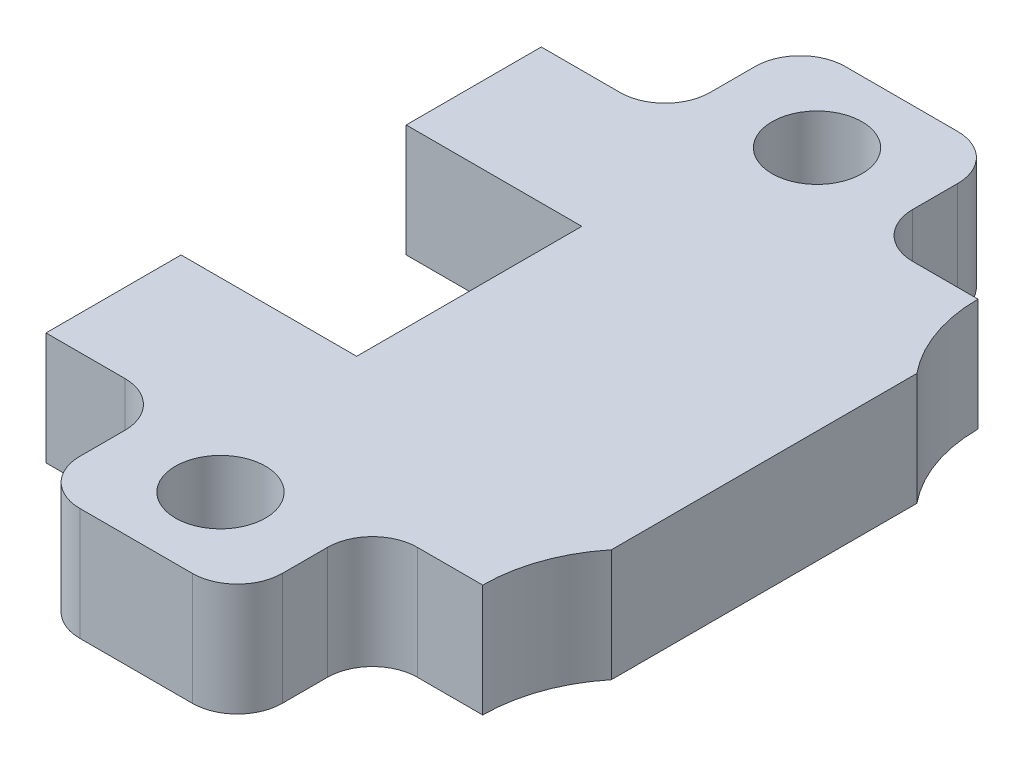
ISO-10303-21;
HEADER;
FILE_DESCRIPTION(('STEP AP214'),'2;1');
FILE_NAME('part.step','',(''),(''),'','','');
FILE_SCHEMA(('AUTOMOTIVE_DESIGN { 1 0 10303 214 1 1 1 1 }'));
ENDSEC;
DATA;
#1=APPLICATION_CONTEXT('core data for automotive mechanical design processes');
#2=APPLICATION_PROTOCOL_DEFINITION('international standard','automotive_design',2000,#1);
#3=PRODUCT_CONTEXT('',#1,'mechanical');
#4=PRODUCT('Part','Part','',(#3));
#5=PRODUCT_RELATED_PRODUCT_CATEGORY('part','',(#4));
#6=PRODUCT_DEFINITION_FORMATION('','',#4);
#7=PRODUCT_DEFINITION_CONTEXT('part definition',#1,'design');
#8=PRODUCT_DEFINITION('design','',#6,#7);
#9=PRODUCT_DEFINITION_SHAPE('','',#8);
#10=(LENGTH_UNIT() NAMED_UNIT(*) SI_UNIT(.MILLI.,.METRE.));
#11=(NAMED_UNIT(*) PLANE_ANGLE_UNIT() SI_UNIT($,.RADIAN.));
#12=(NAMED_UNIT(*) SI_UNIT($,.STERADIAN.) SOLID_ANGLE_UNIT());
#13=UNCERTAINTY_MEASURE_WITH_UNIT(LENGTH_MEASURE(1.E-05),#10,'distance_accuracy_value','');
#14=(GEOMETRIC_REPRESENTATION_CONTEXT(3) GLOBAL_UNCERTAINTY_ASSIGNED_CONTEXT((#13)) GLOBAL_UNIT_ASSIGNED_CONTEXT((#10,
#11,#12)) REPRESENTATION_CONTEXT('',''));
#15=CARTESIAN_POINT('',(0.,0.,0.));
#16=DIRECTION('',(0.,0.,1.));
#17=DIRECTION('',(1.,0.,0.));
#18=AXIS2_PLACEMENT_3D('',#15,#16,#17);
#19=CARTESIAN_POINT('',(12.5,101.4,-27.7));
#20=DIRECTION('',(0.,1.,0.));
#21=DIRECTION('',(0.,0.,1.));
#22=AXIS2_PLACEMENT_3D('',#19,#20,#21);
#23=PLANE('',#22);
#24=CARTESIAN_POINT('',(10.,101.4,0.549999999999988));
#25=DIRECTION('',(0.,1.,0.));
#26=DIRECTION('',(0.,0.,1.));
#27=AXIS2_PLACEMENT_3D('',#24,#25,#26);
#28=CIRCLE('',#27,2.);
#29=CARTESIAN_POINT('',(10.,101.4,2.54999999999999));
#30=VERTEX_POINT('',#29);
#31=EDGE_CURVE('E335',#30,#30,#28,.T.);
#32=ORIENTED_EDGE('',*,*,#31,.F.);
#33=EDGE_LOOP('',(#32));
#34=FACE_BOUND('',#33,.T.);
#35=CARTESIAN_POINT('',(12.5,101.4,-27.7));
#36=DIRECTION('',(0.,1.,0.));
#37=DIRECTION('',(0.,0.,1.));
#38=AXIS2_PLACEMENT_3D('',#35,#36,#37);
#39=CIRCLE('',#38,2.);
#40=CARTESIAN_POINT('',(14.5,101.4,-27.7));
#41=VERTEX_POINT('',#40);
#42=CARTESIAN_POINT('',(12.5,101.4,-29.7));
#43=VERTEX_POINT('',#42);
#44=EDGE_CURVE('E382',#41,#43,#39,.T.);
#45=ORIENTED_EDGE('',*,*,#44,.T.);
#46=DIRECTION('',(-1.,0.,0.));
#47=VECTOR('',#46,1.);
#48=CARTESIAN_POINT('',(12.5,101.4,-29.7));
#49=LINE('',#48,#47);
#50=CARTESIAN_POINT('',(7.5,101.4,-29.7));
#51=VERTEX_POINT('',#50);
#52=EDGE_CURVE('E240',#43,#51,#49,.T.);
#53=ORIENTED_EDGE('',*,*,#52,.T.);
#54=CARTESIAN_POINT('',(7.5,101.4,-27.7));
#55=DIRECTION('',(0.,1.,0.));
#56=DIRECTION('',(0.,0.,1.));
#57=AXIS2_PLACEMENT_3D('',#54,#55,#56);
#58=CIRCLE('',#57,2.);
#59=CARTESIAN_POINT('',(5.5,101.4,-27.7));
#60=VERTEX_POINT('',#59);
#61=EDGE_CURVE('E451',#51,#60,#58,.T.);
#62=ORIENTED_EDGE('',*,*,#61,.T.);
#63=DIRECTION('',(0.,0.,1.));
#64=VECTOR('',#63,1.);
#65=CARTESIAN_POINT('',(5.5,101.4,-27.7));
#66=LINE('',#65,#64);
#67=CARTESIAN_POINT('',(5.5,101.4,-25.7));
#68=VERTEX_POINT('',#67);
#69=EDGE_CURVE('E470',#60,#68,#66,.T.);
#70=ORIENTED_EDGE('',*,*,#69,.T.);
#71=CARTESIAN_POINT('',(3.5,101.4,-25.7));
#72=DIRECTION('',(0.,-1.,0.));
#73=DIRECTION('',(0.,0.,1.));
#74=AXIS2_PLACEMENT_3D('',#71,#72,#73);
#75=CIRCLE('',#74,2.);
#76=CARTESIAN_POINT('',(3.5,101.4,-23.7));
#77=VERTEX_POINT('',#76);
#78=EDGE_CURVE('E467',#68,#77,#75,.T.);
#79=ORIENTED_EDGE('',*,*,#78,.T.);
#80=DIRECTION('',(-1.,0.,0.));
#81=VECTOR('',#80,1.);
#82=CARTESIAN_POINT('',(3.5,101.4,-23.7));
#83=LINE('',#82,#81);
#84=CARTESIAN_POINT('',(0.,101.4,-23.7));
#85=VERTEX_POINT('',#84);
#86=EDGE_CURVE('E469',#77,#85,#83,.T.);
#87=ORIENTED_EDGE('',*,*,#86,.T.);
#88=DIRECTION('',(0.,0.,1.));
#89=VECTOR('',#88,1.);
#90=CARTESIAN_POINT('',(0.,101.4,-17.7));
#91=LINE('',#90,#89);
#92=CARTESIAN_POINT('',(0.,101.4,-17.7));
#93=VERTEX_POINT('',#92);
#94=EDGE_CURVE('E472',#85,#93,#91,.T.);
#95=ORIENTED_EDGE('',*,*,#94,.T.);
#96=DIRECTION('',(1.,0.,0.));
#97=VECTOR('',#96,1.);
#98=CARTESIAN_POINT('',(7.8,101.4,-17.7));
#99=LINE('',#98,#97);
#100=CARTESIAN_POINT('',(7.8,101.4,-17.7));
#101=VERTEX_POINT('',#100);
#102=EDGE_CURVE('E478',#93,#101,#99,.T.);
#103=ORIENTED_EDGE('',*,*,#102,.T.);
#104=DIRECTION('',(0.,0.,1.));
#105=VECTOR('',#104,1.);
#106=CARTESIAN_POINT('',(7.8,101.4,-7.7));
#107=LINE('',#106,#105);
#108=CARTESIAN_POINT('',(7.8,101.4,-7.7));
#109=VERTEX_POINT('',#108);
#110=EDGE_CURVE('E480',#101,#109,#107,.T.);
#111=ORIENTED_EDGE('',*,*,#110,.T.);
#112=DIRECTION('',(-1.,0.,0.));
#113=VECTOR('',#112,1.);
#114=CARTESIAN_POINT('',(0.,101.4,-7.7));
#115=LINE('',#114,#113);
#116=CARTESIAN_POINT('',(0.,101.4,-7.7));
#117=VERTEX_POINT('',#116);
#118=EDGE_CURVE('E482',#109,#117,#115,.T.);
#119=ORIENTED_EDGE('',*,*,#118,.T.);
#120=DIRECTION('',(0.,0.,1.));
#121=VECTOR('',#120,1.);
#122=CARTESIAN_POINT('',(0.,101.4,-1.7));
#123=LINE('',#122,#121);
#124=CARTESIAN_POINT('',(0.,101.4,-1.7));
#125=VERTEX_POINT('',#124);
#126=EDGE_CURVE('E484',#117,#125,#123,.T.);
#127=ORIENTED_EDGE('',*,*,#126,.T.);
#128=DIRECTION('',(1.,0.,0.));
#129=VECTOR('',#128,1.);
#130=CARTESIAN_POINT('',(0.,101.4,-1.7));
#131=LINE('',#130,#129);
#132=CARTESIAN_POINT('',(3.5,101.4,-1.7));
#133=VERTEX_POINT('',#132);
#134=EDGE_CURVE('E486',#125,#133,#131,.T.);
#135=ORIENTED_EDGE('',*,*,#134,.T.);
#136=CARTESIAN_POINT('',(3.5,101.4,0.3));
#137=DIRECTION('',(0.,-1.,0.));
#138=DIRECTION('',(0.,0.,1.));
#139=AXIS2_PLACEMENT_3D('',#136,#137,#138);
#140=CIRCLE('',#139,2.);
#141=CARTESIAN_POINT('',(5.5,101.4,0.3));
#142=VERTEX_POINT('',#141);
#143=EDGE_CURVE('E488',#133,#142,#140,.T.);
#144=ORIENTED_EDGE('',*,*,#143,.T.);
#145=DIRECTION('',(0.,0.,1.));
#146=VECTOR('',#145,1.);
#147=CARTESIAN_POINT('',(5.5,101.4,0.299999999999999));
#148=LINE('',#147,#146);
#149=CARTESIAN_POINT('',(5.5,101.4,2.3));
#150=VERTEX_POINT('',#149);
#151=EDGE_CURVE('E490',#142,#150,#148,.T.);
#152=ORIENTED_EDGE('',*,*,#151,.T.);
#153=CARTESIAN_POINT('',(7.5,101.4,2.3));
#154=DIRECTION('',(0.,1.,0.));
#155=DIRECTION('',(0.,0.,1.));
#156=AXIS2_PLACEMENT_3D('',#153,#154,#155);
#157=CIRCLE('',#156,2.);
#158=CARTESIAN_POINT('',(7.5,101.4,4.3));
#159=VERTEX_POINT('',#158);
#160=EDGE_CURVE('E492',#150,#159,#157,.T.);
#161=ORIENTED_EDGE('',*,*,#160,.T.);
#162=DIRECTION('',(1.,0.,0.));
#163=VECTOR('',#162,1.);
#164=CARTESIAN_POINT('',(7.5,101.4,4.3));
#165=LINE('',#164,#163);
#166=CARTESIAN_POINT('',(12.5,101.4,4.3));
#167=VERTEX_POINT('',#166);
#168=EDGE_CURVE('E494',#159,#167,#165,.T.);
#169=ORIENTED_EDGE('',*,*,#168,.T.);
#170=CARTESIAN_POINT('',(12.5,101.4,2.3));
#171=DIRECTION('',(0.,1.,0.));
#172=DIRECTION('',(0.,0.,1.));
#173=AXIS2_PLACEMENT_3D('',#170,#171,#172);
#174=CIRCLE('',#173,2.);
#175=CARTESIAN_POINT('',(14.5,101.4,2.3));
#176=VERTEX_POINT('',#175);
#177=EDGE_CURVE('E496',#167,#176,#174,.T.);
#178=ORIENTED_EDGE('',*,*,#177,.T.);
#179=DIRECTION('',(0.,0.,-1.));
#180=VECTOR('',#179,1.);
#181=CARTESIAN_POINT('',(14.5,101.4,2.3));
#182=LINE('',#181,#180);
#183=CARTESIAN_POINT('',(14.5,101.4,0.3));
#184=VERTEX_POINT('',#183);
#185=EDGE_CURVE('E498',#176,#184,#182,.T.);
#186=ORIENTED_EDGE('',*,*,#185,.T.);
#187=CARTESIAN_POINT('',(16.5,101.4,0.3));
#188=DIRECTION('',(0.,-1.,0.));
#189=DIRECTION('',(0.,0.,1.));
#190=AXIS2_PLACEMENT_3D('',#187,#188,#189);
#191=CIRCLE('',#190,2.);
#192=CARTESIAN_POINT('',(16.5,101.4,-1.7));
#193=VERTEX_POINT('',#192);
#194=EDGE_CURVE('E500',#184,#193,#191,.T.);
#195=ORIENTED_EDGE('',*,*,#194,.T.);
#196=DIRECTION('',(1.,0.,0.));
#197=VECTOR('',#196,1.);
#198=CARTESIAN_POINT('',(16.5,101.4,-1.7));
#199=LINE('',#198,#197);
#200=CARTESIAN_POINT('',(19.4,101.4,-1.7));
#201=VERTEX_POINT('',#200);
#202=EDGE_CURVE('E502',#193,#201,#199,.T.);
#203=ORIENTED_EDGE('',*,*,#202,.T.);
#204=CARTESIAN_POINT('',(26.075,101.4,-1.7));
#205=DIRECTION('',(0.,-1.,0.));
#206=DIRECTION('',(0.,0.,1.));
#207=AXIS2_PLACEMENT_3D('',#204,#205,#206);
#208=CIRCLE('',#207,6.67500000000001);
#209=CARTESIAN_POINT('',(20.9,101.4,-5.91604079676656));
#210=VERTEX_POINT('',#209);
#211=EDGE_CURVE('E504',#201,#210,#208,.T.);
#212=ORIENTED_EDGE('',*,*,#211,.T.);
#213=DIRECTION('',(0.,0.,-1.));
#214=VECTOR('',#213,1.);
#215=CARTESIAN_POINT('',(20.9,101.4,-5.91604079676656));
#216=LINE('',#215,#214);
#217=CARTESIAN_POINT('',(20.9,101.4,-19.4839592032334));
#218=VERTEX_POINT('',#217);
#219=EDGE_CURVE('E506',#210,#218,#216,.T.);
#220=ORIENTED_EDGE('',*,*,#219,.T.);
#221=CARTESIAN_POINT('',(26.075,101.4,-23.7));
#222=DIRECTION('',(0.,-1.,0.));
#223=DIRECTION('',(0.,0.,1.));
#224=AXIS2_PLACEMENT_3D('',#221,#222,#223);
#225=CIRCLE('',#224,6.67500000000001);
#226=CARTESIAN_POINT('',(19.4,101.4,-23.7));
#227=VERTEX_POINT('',#226);
#228=EDGE_CURVE('E313',#218,#227,#225,.T.);
#229=ORIENTED_EDGE('',*,*,#228,.T.);
#230=DIRECTION('',(-1.,0.,0.));
#231=VECTOR('',#230,1.);
#232=CARTESIAN_POINT('',(19.4,101.4,-23.7));
#233=LINE('',#232,#231);
#234=CARTESIAN_POINT('',(16.5,101.4,-23.7));
#235=VERTEX_POINT('',#234);
#236=EDGE_CURVE('E307',#227,#235,#233,.T.);
#237=ORIENTED_EDGE('',*,*,#236,.T.);
#238=CARTESIAN_POINT('',(16.5,101.4,-25.7));
#239=DIRECTION('',(0.,-1.,0.));
#240=DIRECTION('',(0.,0.,1.));
#241=AXIS2_PLACEMENT_3D('',#238,#239,#240);
#242=CIRCLE('',#241,1.99999999999999);
#243=CARTESIAN_POINT('',(14.5,101.4,-25.7));
#244=VERTEX_POINT('',#243);
#245=EDGE_CURVE('E311',#235,#244,#242,.T.);
#246=ORIENTED_EDGE('',*,*,#245,.T.);
#247=DIRECTION('',(0.,0.,-1.));
#248=VECTOR('',#247,1.);
#249=CARTESIAN_POINT('',(14.5,101.4,-25.7));
#250=LINE('',#249,#248);
#251=EDGE_CURVE('E143',#244,#41,#250,.T.);
#252=ORIENTED_EDGE('',*,*,#251,.T.);
#253=EDGE_LOOP('',(#45,#53,#62,#70,#79,#87,#95,#103,#111,#119,#127,#135,#144,#152,#161,#169,
#178,#186,#195,#203,#212,#220,#229,#237,#246,#252));
#254=FACE_BOUND('',#253,.T.);
#255=CARTESIAN_POINT('',(10.,101.4,-25.95));
#256=DIRECTION('',(0.,1.,0.));
#257=DIRECTION('',(0.,0.,1.));
#258=AXIS2_PLACEMENT_3D('',#255,#256,#257);
#259=CIRCLE('',#258,2.);
#260=CARTESIAN_POINT('',(10.,101.4,-23.95));
#261=VERTEX_POINT('',#260);
#262=EDGE_CURVE('E548',#261,#261,#259,.T.);
#263=ORIENTED_EDGE('',*,*,#262,.F.);
#264=EDGE_LOOP('',(#263));
#265=FACE_BOUND('',#264,.T.);
#266=ADVANCED_FACE('F126',(#34,#254,#265),#23,.T.);
#267=CARTESIAN_POINT('',(12.5,96.4,-27.7));
#268=DIRECTION('',(0.,1.,0.));
#269=DIRECTION('',(0.,0.,1.));
#270=AXIS2_PLACEMENT_3D('',#267,#268,#269);
#271=PLANE('',#270);
#272=CARTESIAN_POINT('',(12.5,96.4,-27.7));
#273=DIRECTION('',(0.,1.,0.));
#274=DIRECTION('',(0.,0.,1.));
#275=AXIS2_PLACEMENT_3D('',#272,#273,#274);
#276=CIRCLE('',#275,2.);
#277=CARTESIAN_POINT('',(14.5,96.4,-27.7));
#278=VERTEX_POINT('',#277);
#279=CARTESIAN_POINT('',(12.5,96.4,-29.7));
#280=VERTEX_POINT('',#279);
#281=EDGE_CURVE('E331',#278,#280,#276,.T.);
#282=ORIENTED_EDGE('',*,*,#281,.F.);
#283=DIRECTION('',(0.,0.,-1.));
#284=VECTOR('',#283,1.);
#285=CARTESIAN_POINT('',(14.5,96.4,-25.7));
#286=LINE('',#285,#284);
#287=CARTESIAN_POINT('',(14.5,96.4,-25.7));
#288=VERTEX_POINT('',#287);
#289=EDGE_CURVE('E232',#288,#278,#286,.T.);
#290=ORIENTED_EDGE('',*,*,#289,.F.);
#291=CARTESIAN_POINT('',(16.5,96.4,-25.7));
#292=DIRECTION('',(0.,-1.,0.));
#293=DIRECTION('',(0.,0.,1.));
#294=AXIS2_PLACEMENT_3D('',#291,#292,#293);
#295=CIRCLE('',#294,1.99999999999999);
#296=CARTESIAN_POINT('',(16.5,96.4,-23.7));
#297=VERTEX_POINT('',#296);
#298=EDGE_CURVE('E226',#297,#288,#295,.T.);
#299=ORIENTED_EDGE('',*,*,#298,.F.);
#300=DIRECTION('',(-1.,0.,0.));
#301=VECTOR('',#300,1.);
#302=CARTESIAN_POINT('',(19.4,96.4,-23.7));
#303=LINE('',#302,#301);
#304=CARTESIAN_POINT('',(19.4,96.4,-23.7));
#305=VERTEX_POINT('',#304);
#306=EDGE_CURVE('E321',#305,#297,#303,.T.);
#307=ORIENTED_EDGE('',*,*,#306,.F.);
#308=CARTESIAN_POINT('',(26.075,96.4,-23.7));
#309=DIRECTION('',(0.,-1.,0.));
#310=DIRECTION('',(0.,0.,1.));
#311=AXIS2_PLACEMENT_3D('',#308,#309,#310);
#312=CIRCLE('',#311,6.67500000000001);
#313=CARTESIAN_POINT('',(20.9,96.4,-19.4839592032334));
#314=VERTEX_POINT('',#313);
#315=EDGE_CURVE('E377',#314,#305,#312,.T.);
#316=ORIENTED_EDGE('',*,*,#315,.F.);
#317=DIRECTION('',(0.,0.,-1.));
#318=VECTOR('',#317,1.);
#319=CARTESIAN_POINT('',(20.9,96.4,-5.91604079676656));
#320=LINE('',#319,#318);
#321=CARTESIAN_POINT('',(20.9,96.4,-5.91604079676656));
#322=VERTEX_POINT('',#321);
#323=EDGE_CURVE('E375',#322,#314,#320,.T.);
#324=ORIENTED_EDGE('',*,*,#323,.F.);
#325=CARTESIAN_POINT('',(26.075,96.4,-1.7));
#326=DIRECTION('',(0.,-1.,0.));
#327=DIRECTION('',(0.,0.,1.));
#328=AXIS2_PLACEMENT_3D('',#325,#326,#327);
#329=CIRCLE('',#328,6.67500000000001);
#330=CARTESIAN_POINT('',(19.4,96.4,-1.7));
#331=VERTEX_POINT('',#330);
#332=EDGE_CURVE('E373',#331,#322,#329,.T.);
#333=ORIENTED_EDGE('',*,*,#332,.F.);
#334=DIRECTION('',(1.,0.,0.));
#335=VECTOR('',#334,1.);
#336=CARTESIAN_POINT('',(16.5,96.4,-1.7));
#337=LINE('',#336,#335);
#338=CARTESIAN_POINT('',(16.5,96.4,-1.7));
#339=VERTEX_POINT('',#338);
#340=EDGE_CURVE('E371',#339,#331,#337,.T.);
#341=ORIENTED_EDGE('',*,*,#340,.F.);
#342=CARTESIAN_POINT('',(16.5,96.4,0.3));
#343=DIRECTION('',(0.,-1.,0.));
#344=DIRECTION('',(0.,0.,1.));
#345=AXIS2_PLACEMENT_3D('',#342,#343,#344);
#346=CIRCLE('',#345,2.);
#347=CARTESIAN_POINT('',(14.5,96.4,0.3));
#348=VERTEX_POINT('',#347);
#349=EDGE_CURVE('E369',#348,#339,#346,.T.);
#350=ORIENTED_EDGE('',*,*,#349,.F.);
#351=DIRECTION('',(0.,0.,-1.));
#352=VECTOR('',#351,1.);
#353=CARTESIAN_POINT('',(14.5,96.4,2.3));
#354=LINE('',#353,#352);
#355=CARTESIAN_POINT('',(14.5,96.4,2.3));
#356=VERTEX_POINT('',#355);
#357=EDGE_CURVE('E367',#356,#348,#354,.T.);
#358=ORIENTED_EDGE('',*,*,#357,.F.);
#359=CARTESIAN_POINT('',(12.5,96.4,2.3));
#360=DIRECTION('',(0.,1.,0.));
#361=DIRECTION('',(0.,0.,1.));
#362=AXIS2_PLACEMENT_3D('',#359,#360,#361);
#363=CIRCLE('',#362,2.);
#364=CARTESIAN_POINT('',(12.5,96.4,4.3));
#365=VERTEX_POINT('',#364);
#366=EDGE_CURVE('E365',#365,#356,#363,.T.);
#367=ORIENTED_EDGE('',*,*,#366,.F.);
#368=DIRECTION('',(1.,0.,0.));
#369=VECTOR('',#368,1.);
#370=CARTESIAN_POINT('',(7.5,96.4,4.3));
#371=LINE('',#370,#369);
#372=CARTESIAN_POINT('',(7.5,96.4,4.3));
#373=VERTEX_POINT('',#372);
#374=EDGE_CURVE('E363',#373,#365,#371,.T.);
#375=ORIENTED_EDGE('',*,*,#374,.F.);
#376=CARTESIAN_POINT('',(7.5,96.4,2.3));
#377=DIRECTION('',(0.,1.,0.));
#378=DIRECTION('',(0.,0.,1.));
#379=AXIS2_PLACEMENT_3D('',#376,#377,#378);
#380=CIRCLE('',#379,2.);
#381=CARTESIAN_POINT('',(5.5,96.4,2.3));
#382=VERTEX_POINT('',#381);
#383=EDGE_CURVE('E361',#382,#373,#380,.T.);
#384=ORIENTED_EDGE('',*,*,#383,.F.);
#385=DIRECTION('',(0.,0.,1.));
#386=VECTOR('',#385,1.);
#387=CARTESIAN_POINT('',(5.5,96.4,0.299999999999999));
#388=LINE('',#387,#386);
#389=CARTESIAN_POINT('',(5.5,96.4,0.3));
#390=VERTEX_POINT('',#389);
#391=EDGE_CURVE('E359',#390,#382,#388,.T.);
#392=ORIENTED_EDGE('',*,*,#391,.F.);
#393=CARTESIAN_POINT('',(3.5,96.4,0.3));
#394=DIRECTION('',(0.,-1.,0.));
#395=DIRECTION('',(0.,0.,1.));
#396=AXIS2_PLACEMENT_3D('',#393,#394,#395);
#397=CIRCLE('',#396,2.);
#398=CARTESIAN_POINT('',(3.5,96.4,-1.7));
#399=VERTEX_POINT('',#398);
#400=EDGE_CURVE('E357',#399,#390,#397,.T.);
#401=ORIENTED_EDGE('',*,*,#400,.F.);
#402=DIRECTION('',(1.,0.,0.));
#403=VECTOR('',#402,1.);
#404=CARTESIAN_POINT('',(0.,96.4,-1.7));
#405=LINE('',#404,#403);
#406=CARTESIAN_POINT('',(0.,96.4,-1.7));
#407=VERTEX_POINT('',#406);
#408=EDGE_CURVE('E355',#407,#399,#405,.T.);
#409=ORIENTED_EDGE('',*,*,#408,.F.);
#410=DIRECTION('',(0.,0.,1.));
#411=VECTOR('',#410,1.);
#412=CARTESIAN_POINT('',(0.,96.4,-1.7));
#413=LINE('',#412,#411);
#414=CARTESIAN_POINT('',(0.,96.4,-7.7));
#415=VERTEX_POINT('',#414);
#416=EDGE_CURVE('E353',#415,#407,#413,.T.);
#417=ORIENTED_EDGE('',*,*,#416,.F.);
#418=DIRECTION('',(-1.,0.,0.));
#419=VECTOR('',#418,1.);
#420=CARTESIAN_POINT('',(0.,96.4,-7.7));
#421=LINE('',#420,#419);
#422=CARTESIAN_POINT('',(7.8,96.4,-7.7));
#423=VERTEX_POINT('',#422);
#424=EDGE_CURVE('E351',#423,#415,#421,.T.);
#425=ORIENTED_EDGE('',*,*,#424,.F.);
#426=DIRECTION('',(0.,0.,1.));
#427=VECTOR('',#426,1.);
#428=CARTESIAN_POINT('',(7.8,96.4,-7.7));
#429=LINE('',#428,#427);
#430=CARTESIAN_POINT('',(7.8,96.4,-17.7));
#431=VERTEX_POINT('',#430);
#432=EDGE_CURVE('E349',#431,#423,#429,.T.);
#433=ORIENTED_EDGE('',*,*,#432,.F.);
#434=DIRECTION('',(1.,0.,0.));
#435=VECTOR('',#434,1.);
#436=CARTESIAN_POINT('',(7.8,96.4,-17.7));
#437=LINE('',#436,#435);
#438=CARTESIAN_POINT('',(0.,96.4,-17.7));
#439=VERTEX_POINT('',#438);
#440=EDGE_CURVE('E347',#439,#431,#437,.T.);
#441=ORIENTED_EDGE('',*,*,#440,.F.);
#442=DIRECTION('',(0.,0.,1.));
#443=VECTOR('',#442,1.);
#444=CARTESIAN_POINT('',(0.,96.4,-17.7));
#445=LINE('',#444,#443);
#446=CARTESIAN_POINT('',(0.,96.4,-23.7));
#447=VERTEX_POINT('',#446);
#448=EDGE_CURVE('E345',#447,#439,#445,.T.);
#449=ORIENTED_EDGE('',*,*,#448,.F.);
#450=DIRECTION('',(-1.,0.,0.));
#451=VECTOR('',#450,1.);
#452=CARTESIAN_POINT('',(3.5,96.4,-23.7));
#453=LINE('',#452,#451);
#454=CARTESIAN_POINT('',(3.5,96.4,-23.7));
#455=VERTEX_POINT('',#454);
#456=EDGE_CURVE('E343',#455,#447,#453,.T.);
#457=ORIENTED_EDGE('',*,*,#456,.F.);
#458=CARTESIAN_POINT('',(3.5,96.4,-25.7));
#459=DIRECTION('',(0.,-1.,0.));
#460=DIRECTION('',(0.,0.,1.));
#461=AXIS2_PLACEMENT_3D('',#458,#459,#460);
#462=CIRCLE('',#461,2.);
#463=CARTESIAN_POINT('',(5.5,96.4,-25.7));
#464=VERTEX_POINT('',#463);
#465=EDGE_CURVE('E341',#464,#455,#462,.T.);
#466=ORIENTED_EDGE('',*,*,#465,.F.);
#467=DIRECTION('',(0.,0.,1.));
#468=VECTOR('',#467,1.);
#469=CARTESIAN_POINT('',(5.5,96.4,-27.7));
#470=LINE('',#469,#468);
#471=CARTESIAN_POINT('',(5.5,96.4,-27.7));
#472=VERTEX_POINT('',#471);
#473=EDGE_CURVE('E339',#472,#464,#470,.T.);
#474=ORIENTED_EDGE('',*,*,#473,.F.);
#475=CARTESIAN_POINT('',(7.5,96.4,-27.7));
#476=DIRECTION('',(0.,1.,0.));
#477=DIRECTION('',(0.,0.,1.));
#478=AXIS2_PLACEMENT_3D('',#475,#476,#477);
#479=CIRCLE('',#478,2.);
#480=CARTESIAN_POINT('',(7.5,96.4,-29.7));
#481=VERTEX_POINT('',#480);
#482=EDGE_CURVE('E337',#481,#472,#479,.T.);
#483=ORIENTED_EDGE('',*,*,#482,.F.);
#484=DIRECTION('',(-1.,0.,0.));
#485=VECTOR('',#484,1.);
#486=CARTESIAN_POINT('',(12.5,96.4,-29.7));
#487=LINE('',#486,#485);
#488=EDGE_CURVE('E334',#280,#481,#487,.T.);
#489=ORIENTED_EDGE('',*,*,#488,.F.);
#490=EDGE_LOOP('',(#282,#290,#299,#307,#316,#324,#333,#341,#350,#358,#367,#375,#384,#392,#401,
#409,#417,#425,#433,#441,#449,#457,#466,#474,#483,#489));
#491=FACE_BOUND('',#490,.T.);
#492=CARTESIAN_POINT('',(10.,96.4,0.549999999999988));
#493=DIRECTION('',(0.,1.,0.));
#494=DIRECTION('',(0.,0.,1.));
#495=AXIS2_PLACEMENT_3D('',#492,#493,#494);
#496=CIRCLE('',#495,2.);
#497=CARTESIAN_POINT('',(10.,96.4,2.54999999999999));
#498=VERTEX_POINT('',#497);
#499=EDGE_CURVE('E554',#498,#498,#496,.T.);
#500=ORIENTED_EDGE('',*,*,#499,.T.);
#501=EDGE_LOOP('',(#500));
#502=FACE_BOUND('',#501,.T.);
#503=CARTESIAN_POINT('',(10.,96.4,-25.95));
#504=DIRECTION('',(0.,1.,0.));
#505=DIRECTION('',(0.,0.,1.));
#506=AXIS2_PLACEMENT_3D('',#503,#504,#505);
#507=CIRCLE('',#506,2.);
#508=CARTESIAN_POINT('',(10.,96.4,-23.95));
#509=VERTEX_POINT('',#508);
#510=EDGE_CURVE('E551',#509,#509,#507,.T.);
#511=ORIENTED_EDGE('',*,*,#510,.T.);
#512=EDGE_LOOP('',(#511));
#513=FACE_BOUND('',#512,.T.);
#514=ADVANCED_FACE('F455',(#491,#502,#513),#271,.F.);
#515=CARTESIAN_POINT('',(12.5,101.4,-27.7));
#516=DIRECTION('',(0.,-1.,0.));
#517=DIRECTION('',(0.,0.,-1.));
#518=AXIS2_PLACEMENT_3D('',#515,#516,#517);
#519=CYLINDRICAL_SURFACE('',#518,2.);
#520=ORIENTED_EDGE('',*,*,#281,.T.);
#521=DIRECTION('',(0.,-1.,0.));
#522=VECTOR('',#521,1.);
#523=CARTESIAN_POINT('',(12.5,101.4,-29.7));
#524=LINE('',#523,#522);
#525=EDGE_CURVE('E12',#43,#280,#524,.T.);
#526=ORIENTED_EDGE('',*,*,#525,.F.);
#527=ORIENTED_EDGE('',*,*,#44,.F.);
#528=DIRECTION('',(0.,-1.,0.));
#529=VECTOR('',#528,1.);
#530=CARTESIAN_POINT('',(14.5,101.4,-27.7));
#531=LINE('',#530,#529);
#532=EDGE_CURVE('E327',#41,#278,#531,.T.);
#533=ORIENTED_EDGE('',*,*,#532,.T.);
#534=EDGE_LOOP('',(#520,#526,#527,#533));
#535=FACE_BOUND('',#534,.T.);
#536=ADVANCED_FACE('F128',(#535),#519,.T.);
#537=CARTESIAN_POINT('',(12.5,101.4,-29.7));
#538=DIRECTION('',(0.,0.,1.));
#539=DIRECTION('',(1.,0.,0.));
#540=AXIS2_PLACEMENT_3D('',#537,#538,#539);
#541=PLANE('',#540);
#542=ORIENTED_EDGE('',*,*,#488,.T.);
#543=DIRECTION('',(0.,-1.,0.));
#544=VECTOR('',#543,1.);
#545=CARTESIAN_POINT('',(7.5,101.4,-29.7));
#546=LINE('',#545,#544);
#547=EDGE_CURVE('E135',#51,#481,#546,.T.);
#548=ORIENTED_EDGE('',*,*,#547,.F.);
#549=ORIENTED_EDGE('',*,*,#52,.F.);
#550=ORIENTED_EDGE('',*,*,#525,.T.);
#551=EDGE_LOOP('',(#542,#548,#549,#550));
#552=FACE_BOUND('',#551,.T.);
#553=ADVANCED_FACE('F787',(#552),#541,.F.);
#554=CARTESIAN_POINT('',(7.5,101.4,-27.7));
#555=DIRECTION('',(0.,-1.,0.));
#556=DIRECTION('',(0.,0.,-1.));
#557=AXIS2_PLACEMENT_3D('',#554,#555,#556);
#558=CYLINDRICAL_SURFACE('',#557,2.);
#559=ORIENTED_EDGE('',*,*,#482,.T.);
#560=DIRECTION('',(0.,-1.,0.));
#561=VECTOR('',#560,1.);
#562=CARTESIAN_POINT('',(5.5,101.4,-27.7));
#563=LINE('',#562,#561);
#564=EDGE_CURVE('E443',#60,#472,#563,.T.);
#565=ORIENTED_EDGE('',*,*,#564,.F.);
#566=ORIENTED_EDGE('',*,*,#61,.F.);
#567=ORIENTED_EDGE('',*,*,#547,.T.);
#568=EDGE_LOOP('',(#559,#565,#566,#567));
#569=FACE_BOUND('',#568,.T.);
#570=ADVANCED_FACE('F449',(#569),#558,.T.);
#571=CARTESIAN_POINT('',(5.5,101.4,-27.7));
#572=DIRECTION('',(1.,0.,0.));
#573=DIRECTION('',(0.,0.,-1.));
#574=AXIS2_PLACEMENT_3D('',#571,#572,#573);
#575=PLANE('',#574);
#576=ORIENTED_EDGE('',*,*,#473,.T.);
#577=DIRECTION('',(0.,-1.,0.));
#578=VECTOR('',#577,1.);
#579=CARTESIAN_POINT('',(5.5,101.4,-25.7));
#580=LINE('',#579,#578);
#581=EDGE_CURVE('E440',#68,#464,#580,.T.);
#582=ORIENTED_EDGE('',*,*,#581,.F.);
#583=ORIENTED_EDGE('',*,*,#69,.F.);
#584=ORIENTED_EDGE('',*,*,#564,.T.);
#585=EDGE_LOOP('',(#576,#582,#583,#584));
#586=FACE_BOUND('',#585,.T.);
#587=ADVANCED_FACE('F461',(#586),#575,.F.);
#588=CARTESIAN_POINT('',(3.5,101.4,-25.7));
#589=DIRECTION('',(0.,-1.,0.));
#590=DIRECTION('',(0.,0.,-1.));
#591=AXIS2_PLACEMENT_3D('',#588,#589,#590);
#592=CYLINDRICAL_SURFACE('',#591,2.);
#593=ORIENTED_EDGE('',*,*,#465,.T.);
#594=DIRECTION('',(0.,-1.,0.));
#595=VECTOR('',#594,1.);
#596=CARTESIAN_POINT('',(3.5,101.4,-23.7));
#597=LINE('',#596,#595);
#598=EDGE_CURVE('E437',#77,#455,#597,.T.);
#599=ORIENTED_EDGE('',*,*,#598,.F.);
#600=ORIENTED_EDGE('',*,*,#78,.F.);
#601=ORIENTED_EDGE('',*,*,#581,.T.);
#602=EDGE_LOOP('',(#593,#599,#600,#601));
#603=FACE_BOUND('',#602,.T.);
#604=ADVANCED_FACE('F465',(#603),#592,.F.);
#605=CARTESIAN_POINT('',(3.5,101.4,-23.7));
#606=DIRECTION('',(0.,0.,1.));
#607=DIRECTION('',(1.,0.,0.));
#608=AXIS2_PLACEMENT_3D('',#605,#606,#607);
#609=PLANE('',#608);
#610=ORIENTED_EDGE('',*,*,#456,.T.);
#611=DIRECTION('',(0.,-1.,0.));
#612=VECTOR('',#611,1.);
#613=CARTESIAN_POINT('',(0.,101.4,-23.7));
#614=LINE('',#613,#612);
#615=EDGE_CURVE('E434',#85,#447,#614,.T.);
#616=ORIENTED_EDGE('',*,*,#615,.F.);
#617=ORIENTED_EDGE('',*,*,#86,.F.);
#618=ORIENTED_EDGE('',*,*,#598,.T.);
#619=EDGE_LOOP('',(#610,#616,#617,#618));
#620=FACE_BOUND('',#619,.T.);
#621=ADVANCED_FACE('F752',(#620),#609,.F.);
#622=CARTESIAN_POINT('',(0.,101.4,-17.7));
#623=DIRECTION('',(1.,0.,0.));
#624=DIRECTION('',(0.,0.,-1.));
#625=AXIS2_PLACEMENT_3D('',#622,#623,#624);
#626=PLANE('',#625);
#627=ORIENTED_EDGE('',*,*,#448,.T.);
#628=DIRECTION('',(0.,-1.,0.));
#629=VECTOR('',#628,1.);
#630=CARTESIAN_POINT('',(0.,101.4,-17.7));
#631=LINE('',#630,#629);
#632=EDGE_CURVE('E431',#93,#439,#631,.T.);
#633=ORIENTED_EDGE('',*,*,#632,.F.);
#634=ORIENTED_EDGE('',*,*,#94,.F.);
#635=ORIENTED_EDGE('',*,*,#615,.T.);
#636=EDGE_LOOP('',(#627,#633,#634,#635));
#637=FACE_BOUND('',#636,.T.);
#638=ADVANCED_FACE('F742',(#637),#626,.F.);
#639=CARTESIAN_POINT('',(7.8,101.4,-17.7));
#640=DIRECTION('',(0.,0.,-1.));
#641=DIRECTION('',(-1.,0.,0.));
#642=AXIS2_PLACEMENT_3D('',#639,#640,#641);
#643=PLANE('',#642);
#644=ORIENTED_EDGE('',*,*,#440,.T.);
#645=DIRECTION('',(0.,-1.,0.));
#646=VECTOR('',#645,1.);
#647=CARTESIAN_POINT('',(7.8,101.4,-17.7));
#648=LINE('',#647,#646);
#649=EDGE_CURVE('E428',#101,#431,#648,.T.);
#650=ORIENTED_EDGE('',*,*,#649,.F.);
#651=ORIENTED_EDGE('',*,*,#102,.F.);
#652=ORIENTED_EDGE('',*,*,#632,.T.);
#653=EDGE_LOOP('',(#644,#650,#651,#652));
#654=FACE_BOUND('',#653,.T.);
#655=ADVANCED_FACE('F732',(#654),#643,.F.);
#656=CARTESIAN_POINT('',(7.8,101.4,-7.7));
#657=DIRECTION('',(1.,0.,0.));
#658=DIRECTION('',(0.,0.,-1.));
#659=AXIS2_PLACEMENT_3D('',#656,#657,#658);
#660=PLANE('',#659);
#661=ORIENTED_EDGE('',*,*,#432,.T.);
#662=DIRECTION('',(0.,-1.,0.));
#663=VECTOR('',#662,1.);
#664=CARTESIAN_POINT('',(7.8,101.4,-7.7));
#665=LINE('',#664,#663);
#666=EDGE_CURVE('E425',#109,#423,#665,.T.);
#667=ORIENTED_EDGE('',*,*,#666,.F.);
#668=ORIENTED_EDGE('',*,*,#110,.F.);
#669=ORIENTED_EDGE('',*,*,#649,.T.);
#670=EDGE_LOOP('',(#661,#667,#668,#669));
#671=FACE_BOUND('',#670,.T.);
#672=ADVANCED_FACE('F722',(#671),#660,.F.);
#673=CARTESIAN_POINT('',(0.,101.4,-7.7));
#674=DIRECTION('',(0.,0.,1.));
#675=DIRECTION('',(1.,0.,0.));
#676=AXIS2_PLACEMENT_3D('',#673,#674,#675);
#677=PLANE('',#676);
#678=ORIENTED_EDGE('',*,*,#424,.T.);
#679=DIRECTION('',(0.,-1.,0.));
#680=VECTOR('',#679,1.);
#681=CARTESIAN_POINT('',(0.,101.4,-7.7));
#682=LINE('',#681,#680);
#683=EDGE_CURVE('E422',#117,#415,#682,.T.);
#684=ORIENTED_EDGE('',*,*,#683,.F.);
#685=ORIENTED_EDGE('',*,*,#118,.F.);
#686=ORIENTED_EDGE('',*,*,#666,.T.);
#687=EDGE_LOOP('',(#678,#684,#685,#686));
#688=FACE_BOUND('',#687,.T.);
#689=ADVANCED_FACE('F712',(#688),#677,.F.);
#690=CARTESIAN_POINT('',(0.,101.4,-1.7));
#691=DIRECTION('',(1.,0.,0.));
#692=DIRECTION('',(0.,0.,-1.));
#693=AXIS2_PLACEMENT_3D('',#690,#691,#692);
#694=PLANE('',#693);
#695=ORIENTED_EDGE('',*,*,#416,.T.);
#696=DIRECTION('',(0.,-1.,0.));
#697=VECTOR('',#696,1.);
#698=CARTESIAN_POINT('',(0.,101.4,-1.7));
#699=LINE('',#698,#697);
#700=EDGE_CURVE('E419',#125,#407,#699,.T.);
#701=ORIENTED_EDGE('',*,*,#700,.F.);
#702=ORIENTED_EDGE('',*,*,#126,.F.);
#703=ORIENTED_EDGE('',*,*,#683,.T.);
#704=EDGE_LOOP('',(#695,#701,#702,#703));
#705=FACE_BOUND('',#704,.T.);
#706=ADVANCED_FACE('F702',(#705),#694,.F.);
#707=CARTESIAN_POINT('',(0.,101.4,-1.7));
#708=DIRECTION('',(0.,0.,-1.));
#709=DIRECTION('',(-1.,0.,0.));
#710=AXIS2_PLACEMENT_3D('',#707,#708,#709);
#711=PLANE('',#710);
#712=ORIENTED_EDGE('',*,*,#408,.T.);
#713=DIRECTION('',(0.,-1.,0.));
#714=VECTOR('',#713,1.);
#715=CARTESIAN_POINT('',(3.5,101.4,-1.7));
#716=LINE('',#715,#714);
#717=EDGE_CURVE('E416',#133,#399,#716,.T.);
#718=ORIENTED_EDGE('',*,*,#717,.F.);
#719=ORIENTED_EDGE('',*,*,#134,.F.);
#720=ORIENTED_EDGE('',*,*,#700,.T.);
#721=EDGE_LOOP('',(#712,#718,#719,#720));
#722=FACE_BOUND('',#721,.T.);
#723=ADVANCED_FACE('F692',(#722),#711,.F.);
#724=CARTESIAN_POINT('',(3.5,101.4,0.3));
#725=DIRECTION('',(0.,-1.,0.));
#726=DIRECTION('',(0.,0.,-1.));
#727=AXIS2_PLACEMENT_3D('',#724,#725,#726);
#728=CYLINDRICAL_SURFACE('',#727,2.);
#729=ORIENTED_EDGE('',*,*,#400,.T.);
#730=DIRECTION('',(0.,-1.,0.));
#731=VECTOR('',#730,1.);
#732=CARTESIAN_POINT('',(5.5,101.4,0.3));
#733=LINE('',#732,#731);
#734=EDGE_CURVE('E413',#142,#390,#733,.T.);
#735=ORIENTED_EDGE('',*,*,#734,.F.);
#736=ORIENTED_EDGE('',*,*,#143,.F.);
#737=ORIENTED_EDGE('',*,*,#717,.T.);
#738=EDGE_LOOP('',(#729,#735,#736,#737));
#739=FACE_BOUND('',#738,.T.);
#740=ADVANCED_FACE('F682',(#739),#728,.F.);
#741=CARTESIAN_POINT('',(5.5,101.4,0.299999999999999));
#742=DIRECTION('',(1.,0.,0.));
#743=DIRECTION('',(0.,0.,-1.));
#744=AXIS2_PLACEMENT_3D('',#741,#742,#743);
#745=PLANE('',#744);
#746=ORIENTED_EDGE('',*,*,#391,.T.);
#747=DIRECTION('',(0.,-1.,0.));
#748=VECTOR('',#747,1.);
#749=CARTESIAN_POINT('',(5.5,101.4,2.3));
#750=LINE('',#749,#748);
#751=EDGE_CURVE('E410',#150,#382,#750,.T.);
#752=ORIENTED_EDGE('',*,*,#751,.F.);
#753=ORIENTED_EDGE('',*,*,#151,.F.);
#754=ORIENTED_EDGE('',*,*,#734,.T.);
#755=EDGE_LOOP('',(#746,#752,#753,#754));
#756=FACE_BOUND('',#755,.T.);
#757=ADVANCED_FACE('F672',(#756),#745,.F.);
#758=CARTESIAN_POINT('',(7.5,101.4,2.3));
#759=DIRECTION('',(0.,-1.,0.));
#760=DIRECTION('',(0.,0.,-1.));
#761=AXIS2_PLACEMENT_3D('',#758,#759,#760);
#762=CYLINDRICAL_SURFACE('',#761,2.);
#763=ORIENTED_EDGE('',*,*,#383,.T.);
#764=DIRECTION('',(0.,-1.,0.));
#765=VECTOR('',#764,1.);
#766=CARTESIAN_POINT('',(7.5,101.4,4.3));
#767=LINE('',#766,#765);
#768=EDGE_CURVE('E407',#159,#373,#767,.T.);
#769=ORIENTED_EDGE('',*,*,#768,.F.);
#770=ORIENTED_EDGE('',*,*,#160,.F.);
#771=ORIENTED_EDGE('',*,*,#751,.T.);
#772=EDGE_LOOP('',(#763,#769,#770,#771));
#773=FACE_BOUND('',#772,.T.);
#774=ADVANCED_FACE('F662',(#773),#762,.T.);
#775=CARTESIAN_POINT('',(7.5,101.4,4.3));
#776=DIRECTION('',(0.,0.,-1.));
#777=DIRECTION('',(-1.,0.,0.));
#778=AXIS2_PLACEMENT_3D('',#775,#776,#777);
#779=PLANE('',#778);
#780=ORIENTED_EDGE('',*,*,#374,.T.);
#781=DIRECTION('',(0.,-1.,0.));
#782=VECTOR('',#781,1.);
#783=CARTESIAN_POINT('',(12.5,101.4,4.3));
#784=LINE('',#783,#782);
#785=EDGE_CURVE('E404',#167,#365,#784,.T.);
#786=ORIENTED_EDGE('',*,*,#785,.F.);
#787=ORIENTED_EDGE('',*,*,#168,.F.);
#788=ORIENTED_EDGE('',*,*,#768,.T.);
#789=EDGE_LOOP('',(#780,#786,#787,#788));
#790=FACE_BOUND('',#789,.T.);
#791=ADVANCED_FACE('F652',(#790),#779,.F.);
#792=CARTESIAN_POINT('',(12.5,101.4,2.3));
#793=DIRECTION('',(0.,-1.,0.));
#794=DIRECTION('',(0.,0.,-1.));
#795=AXIS2_PLACEMENT_3D('',#792,#793,#794);
#796=CYLINDRICAL_SURFACE('',#795,2.);
#797=ORIENTED_EDGE('',*,*,#366,.T.);
#798=DIRECTION('',(0.,-1.,0.));
#799=VECTOR('',#798,1.);
#800=CARTESIAN_POINT('',(14.5,101.4,2.3));
#801=LINE('',#800,#799);
#802=EDGE_CURVE('E401',#176,#356,#801,.T.);
#803=ORIENTED_EDGE('',*,*,#802,.F.);
#804=ORIENTED_EDGE('',*,*,#177,.F.);
#805=ORIENTED_EDGE('',*,*,#785,.T.);
#806=EDGE_LOOP('',(#797,#803,#804,#805));
#807=FACE_BOUND('',#806,.T.);
#808=ADVANCED_FACE('F642',(#807),#796,.T.);
#809=CARTESIAN_POINT('',(14.5,101.4,2.3));
#810=DIRECTION('',(-1.,0.,0.));
#811=DIRECTION('',(0.,0.,1.));
#812=AXIS2_PLACEMENT_3D('',#809,#810,#811);
#813=PLANE('',#812);
#814=ORIENTED_EDGE('',*,*,#357,.T.);
#815=DIRECTION('',(0.,-1.,0.));
#816=VECTOR('',#815,1.);
#817=CARTESIAN_POINT('',(14.5,101.4,0.3));
#818=LINE('',#817,#816);
#819=EDGE_CURVE('E398',#184,#348,#818,.T.);
#820=ORIENTED_EDGE('',*,*,#819,.F.);
#821=ORIENTED_EDGE('',*,*,#185,.F.);
#822=ORIENTED_EDGE('',*,*,#802,.T.);
#823=EDGE_LOOP('',(#814,#820,#821,#822));
#824=FACE_BOUND('',#823,.T.);
#825=ADVANCED_FACE('F632',(#824),#813,.F.);
#826=CARTESIAN_POINT('',(16.5,101.4,0.3));
#827=DIRECTION('',(0.,-1.,0.));
#828=DIRECTION('',(0.,0.,-1.));
#829=AXIS2_PLACEMENT_3D('',#826,#827,#828);
#830=CYLINDRICAL_SURFACE('',#829,2.);
#831=ORIENTED_EDGE('',*,*,#349,.T.);
#832=DIRECTION('',(0.,-1.,0.));
#833=VECTOR('',#832,1.);
#834=CARTESIAN_POINT('',(16.5,101.4,-1.7));
#835=LINE('',#834,#833);
#836=EDGE_CURVE('E395',#193,#339,#835,.T.);
#837=ORIENTED_EDGE('',*,*,#836,.F.);
#838=ORIENTED_EDGE('',*,*,#194,.F.);
#839=ORIENTED_EDGE('',*,*,#819,.T.);
#840=EDGE_LOOP('',(#831,#837,#838,#839));
#841=FACE_BOUND('',#840,.T.);
#842=ADVANCED_FACE('F622',(#841),#830,.F.);
#843=CARTESIAN_POINT('',(16.5,101.4,-1.7));
#844=DIRECTION('',(0.,0.,-1.));
#845=DIRECTION('',(-1.,0.,0.));
#846=AXIS2_PLACEMENT_3D('',#843,#844,#845);
#847=PLANE('',#846);
#848=ORIENTED_EDGE('',*,*,#340,.T.);
#849=DIRECTION('',(0.,-1.,0.));
#850=VECTOR('',#849,1.);
#851=CARTESIAN_POINT('',(19.4,101.4,-1.7));
#852=LINE('',#851,#850);
#853=EDGE_CURVE('E392',#201,#331,#852,.T.);
#854=ORIENTED_EDGE('',*,*,#853,.F.);
#855=ORIENTED_EDGE('',*,*,#202,.F.);
#856=ORIENTED_EDGE('',*,*,#836,.T.);
#857=EDGE_LOOP('',(#848,#854,#855,#856));
#858=FACE_BOUND('',#857,.T.);
#859=ADVANCED_FACE('F612',(#858),#847,.F.);
#860=CARTESIAN_POINT('',(26.075,101.4,-1.7));
#861=DIRECTION('',(0.,-1.,0.));
#862=DIRECTION('',(0.,0.,-1.));
#863=AXIS2_PLACEMENT_3D('',#860,#861,#862);
#864=CYLINDRICAL_SURFACE('',#863,6.67500000000001);
#865=ORIENTED_EDGE('',*,*,#332,.T.);
#866=DIRECTION('',(0.,-1.,0.));
#867=VECTOR('',#866,1.);
#868=CARTESIAN_POINT('',(20.9,101.4,-5.91604079676656));
#869=LINE('',#868,#867);
#870=EDGE_CURVE('E389',#210,#322,#869,.T.);
#871=ORIENTED_EDGE('',*,*,#870,.F.);
#872=ORIENTED_EDGE('',*,*,#211,.F.);
#873=ORIENTED_EDGE('',*,*,#853,.T.);
#874=EDGE_LOOP('',(#865,#871,#872,#873));
#875=FACE_BOUND('',#874,.T.);
#876=ADVANCED_FACE('F603',(#875),#864,.F.);
#877=CARTESIAN_POINT('',(20.9,101.4,-5.91604079676656));
#878=DIRECTION('',(-1.,0.,0.));
#879=DIRECTION('',(0.,0.,1.));
#880=AXIS2_PLACEMENT_3D('',#877,#878,#879);
#881=PLANE('',#880);
#882=ORIENTED_EDGE('',*,*,#323,.T.);
#883=DIRECTION('',(0.,-1.,0.));
#884=VECTOR('',#883,1.);
#885=CARTESIAN_POINT('',(20.9,101.4,-19.4839592032334));
#886=LINE('',#885,#884);
#887=EDGE_CURVE('E386',#218,#314,#886,.T.);
#888=ORIENTED_EDGE('',*,*,#887,.F.);
#889=ORIENTED_EDGE('',*,*,#219,.F.);
#890=ORIENTED_EDGE('',*,*,#870,.T.);
#891=EDGE_LOOP('',(#882,#888,#889,#890));
#892=FACE_BOUND('',#891,.T.);
#893=ADVANCED_FACE('F512',(#892),#881,.F.);
#894=CARTESIAN_POINT('',(26.075,101.4,-23.7));
#895=DIRECTION('',(0.,-1.,0.));
#896=DIRECTION('',(0.,0.,-1.));
#897=AXIS2_PLACEMENT_3D('',#894,#895,#896);
#898=CYLINDRICAL_SURFACE('',#897,6.67500000000001);
#899=ORIENTED_EDGE('',*,*,#315,.T.);
#900=DIRECTION('',(0.,-1.,0.));
#901=VECTOR('',#900,1.);
#902=CARTESIAN_POINT('',(19.4,101.4,-23.7));
#903=LINE('',#902,#901);
#904=EDGE_CURVE('E322',#227,#305,#903,.T.);
#905=ORIENTED_EDGE('',*,*,#904,.F.);
#906=ORIENTED_EDGE('',*,*,#228,.F.);
#907=ORIENTED_EDGE('',*,*,#887,.T.);
#908=EDGE_LOOP('',(#899,#905,#906,#907));
#909=FACE_BOUND('',#908,.T.);
#910=ADVANCED_FACE('F516',(#909),#898,.F.);
#911=CARTESIAN_POINT('',(19.4,101.4,-23.7));
#912=DIRECTION('',(0.,0.,1.));
#913=DIRECTION('',(1.,0.,0.));
#914=AXIS2_PLACEMENT_3D('',#911,#912,#913);
#915=PLANE('',#914);
#916=ORIENTED_EDGE('',*,*,#306,.T.);
#917=DIRECTION('',(0.,-1.,0.));
#918=VECTOR('',#917,1.);
#919=CARTESIAN_POINT('',(16.5,101.4,-23.7));
#920=LINE('',#919,#918);
#921=EDGE_CURVE('E318',#235,#297,#920,.T.);
#922=ORIENTED_EDGE('',*,*,#921,.F.);
#923=ORIENTED_EDGE('',*,*,#236,.F.);
#924=ORIENTED_EDGE('',*,*,#904,.T.);
#925=EDGE_LOOP('',(#916,#922,#923,#924));
#926=FACE_BOUND('',#925,.T.);
#927=ADVANCED_FACE('F319',(#926),#915,.F.);
#928=CARTESIAN_POINT('',(16.5,101.4,-25.7));
#929=DIRECTION('',(0.,-1.,0.));
#930=DIRECTION('',(0.,0.,-1.));
#931=AXIS2_PLACEMENT_3D('',#928,#929,#930);
#932=CYLINDRICAL_SURFACE('',#931,1.99999999999999);
#933=ORIENTED_EDGE('',*,*,#298,.T.);
#934=DIRECTION('',(0.,-1.,0.));
#935=VECTOR('',#934,1.);
#936=CARTESIAN_POINT('',(14.5,101.4,-25.7));
#937=LINE('',#936,#935);
#938=EDGE_CURVE('E323',#244,#288,#937,.T.);
#939=ORIENTED_EDGE('',*,*,#938,.F.);
#940=ORIENTED_EDGE('',*,*,#245,.F.);
#941=ORIENTED_EDGE('',*,*,#921,.T.);
#942=EDGE_LOOP('',(#933,#939,#940,#941));
#943=FACE_BOUND('',#942,.T.);
#944=ADVANCED_FACE('F325',(#943),#932,.F.);
#945=CARTESIAN_POINT('',(14.5,101.4,-25.7));
#946=DIRECTION('',(-1.,0.,0.));
#947=DIRECTION('',(0.,0.,1.));
#948=AXIS2_PLACEMENT_3D('',#945,#946,#947);
#949=PLANE('',#948);
#950=ORIENTED_EDGE('',*,*,#289,.T.);
#951=ORIENTED_EDGE('',*,*,#532,.F.);
#952=ORIENTED_EDGE('',*,*,#251,.F.);
#953=ORIENTED_EDGE('',*,*,#938,.T.);
#954=EDGE_LOOP('',(#950,#951,#952,#953));
#955=FACE_BOUND('',#954,.T.);
#956=ADVANCED_FACE('F520',(#955),#949,.F.);
#957=CARTESIAN_POINT('',(10.,101.4,0.549999999999988));
#958=DIRECTION('',(0.,-1.,0.));
#959=DIRECTION('',(0.,0.,-1.));
#960=AXIS2_PLACEMENT_3D('',#957,#958,#959);
#961=CYLINDRICAL_SURFACE('',#960,2.);
#962=ORIENTED_EDGE('',*,*,#31,.T.);
#963=EDGE_LOOP('',(#962));
#964=FACE_BOUND('',#963,.T.);
#965=ORIENTED_EDGE('',*,*,#499,.F.);
#966=EDGE_LOOP('',(#965));
#967=FACE_BOUND('',#966,.T.);
#968=ADVANCED_FACE('F522',(#964,#967),#961,.F.);
#969=CARTESIAN_POINT('',(10.,101.4,-25.95));
#970=DIRECTION('',(0.,-1.,0.));
#971=DIRECTION('',(0.,0.,-1.));
#972=AXIS2_PLACEMENT_3D('',#969,#970,#971);
#973=CYLINDRICAL_SURFACE('',#972,2.);
#974=ORIENTED_EDGE('',*,*,#262,.T.);
#975=EDGE_LOOP('',(#974));
#976=FACE_BOUND('',#975,.T.);
#977=ORIENTED_EDGE('',*,*,#510,.F.);
#978=EDGE_LOOP('',(#977));
#979=FACE_BOUND('',#978,.T.);
#980=ADVANCED_FACE('F528',(#976,#979),#973,.F.);
#981=CLOSED_SHELL('',(#266,#514,#536,#553,#570,#587,#604,#621,#638,#655,#672,#689,#706,#723,
#740,#757,#774,#791,#808,#825,#842,#859,#876,#893,#910,#927,#944,#956,#968,#980));
#982=MANIFOLD_SOLID_BREP('B2',#981);
#983=ADVANCED_BREP_SHAPE_REPRESENTATION('',(#18,#982),#14);
#984=SHAPE_DEFINITION_REPRESENTATION(#9,#983);
ENDSEC;
END-ISO-10303-21;
